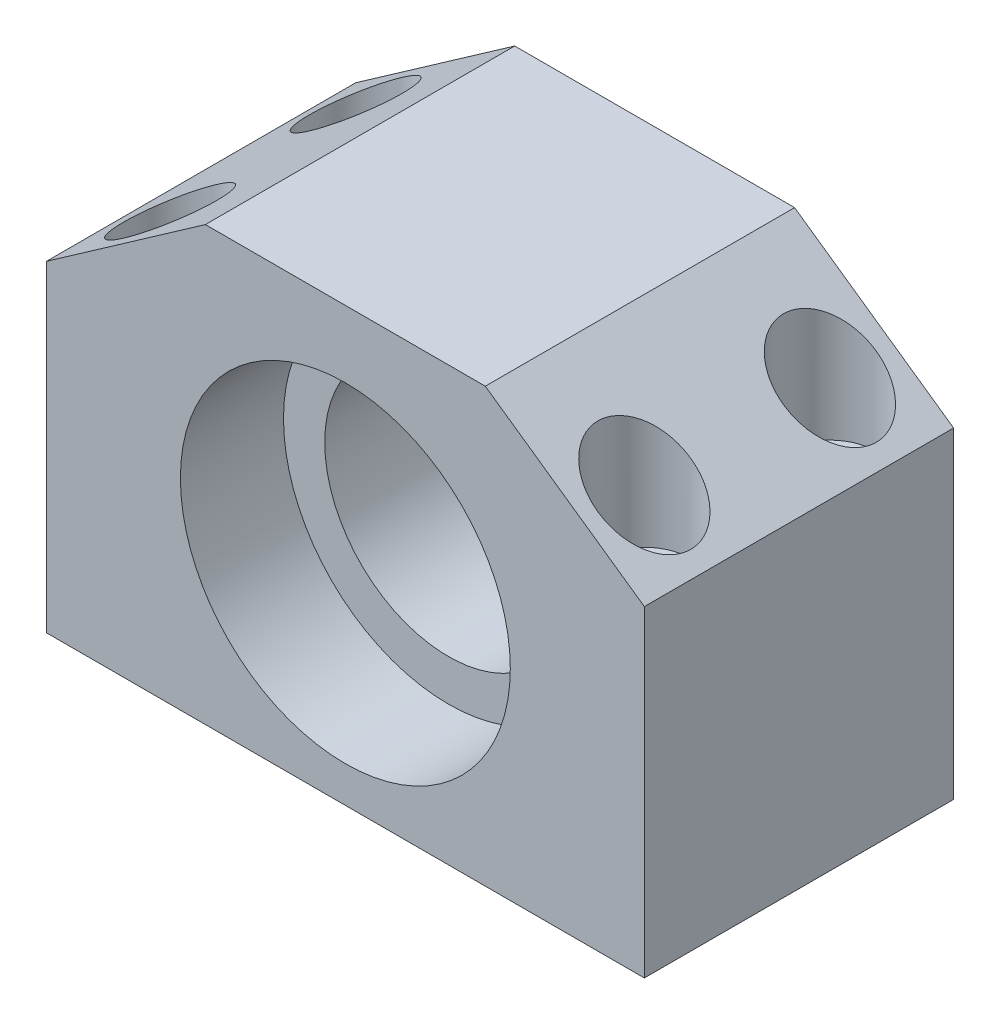
ISO-10303-21;
HEADER;
FILE_DESCRIPTION(('STEP AP214'),'2;1');
FILE_NAME('part.step','',(''),(''),'','','');
FILE_SCHEMA(('AUTOMOTIVE_DESIGN { 1 0 10303 214 1 1 1 1 }'));
ENDSEC;
DATA;
#1=APPLICATION_CONTEXT('core data for automotive mechanical design processes');
#2=APPLICATION_PROTOCOL_DEFINITION('international standard','automotive_design',2000,#1);
#3=PRODUCT_CONTEXT('',#1,'mechanical');
#4=PRODUCT('Part','Part','',(#3));
#5=PRODUCT_RELATED_PRODUCT_CATEGORY('part','',(#4));
#6=PRODUCT_DEFINITION_FORMATION('','',#4);
#7=PRODUCT_DEFINITION_CONTEXT('part definition',#1,'design');
#8=PRODUCT_DEFINITION('design','',#6,#7);
#9=PRODUCT_DEFINITION_SHAPE('','',#8);
#10=(LENGTH_UNIT() NAMED_UNIT(*) SI_UNIT(.MILLI.,.METRE.));
#11=(NAMED_UNIT(*) PLANE_ANGLE_UNIT() SI_UNIT($,.RADIAN.));
#12=(NAMED_UNIT(*) SI_UNIT($,.STERADIAN.) SOLID_ANGLE_UNIT());
#13=UNCERTAINTY_MEASURE_WITH_UNIT(LENGTH_MEASURE(1.E-05),#10,'distance_accuracy_value','');
#14=(GEOMETRIC_REPRESENTATION_CONTEXT(3) GLOBAL_UNCERTAINTY_ASSIGNED_CONTEXT((#13)) GLOBAL_UNIT_ASSIGNED_CONTEXT((#10,
#11,#12)) REPRESENTATION_CONTEXT('',''));
#15=CARTESIAN_POINT('',(0.,0.,0.));
#16=DIRECTION('',(0.,0.,1.));
#17=DIRECTION('',(1.,0.,0.));
#18=AXIS2_PLACEMENT_3D('',#15,#16,#17);
#19=CARTESIAN_POINT('',(-29.,42.,-15.));
#20=DIRECTION('',(0.,0.,1.));
#21=DIRECTION('',(1.,0.,0.));
#22=AXIS2_PLACEMENT_3D('',#19,#20,#21);
#23=PLANE('',#22);
#24=CARTESIAN_POINT('',(0.,19.5,-15.));
#25=DIRECTION('',(0.,0.,1.));
#26=DIRECTION('',(1.,0.,0.));
#27=AXIS2_PLACEMENT_3D('',#24,#25,#26);
#28=CIRCLE('',#27,16.);
#29=CARTESIAN_POINT('',(16.,19.5,-15.));
#30=VERTEX_POINT('',#29);
#31=EDGE_CURVE('E175',#30,#30,#28,.T.);
#32=ORIENTED_EDGE('',*,*,#31,.T.);
#33=EDGE_LOOP('',(#32));
#34=FACE_BOUND('',#33,.T.);
#35=DIRECTION('',(0.819152044288991,0.573576436351047,0.));
#36=VECTOR('',#35,1.);
#37=CARTESIAN_POINT('',(-24.1995227617897,34.5605001963602,-15.));
#38=LINE('',#37,#36);
#39=CARTESIAN_POINT('',(-29.,31.1991698471612,-15.));
#40=VERTEX_POINT('',#39);
#41=CARTESIAN_POINT('',(-13.5748159460632,42.,-15.));
#42=VERTEX_POINT('',#41);
#43=EDGE_CURVE('E49',#40,#42,#38,.T.);
#44=ORIENTED_EDGE('',*,*,#43,.T.);
#45=DIRECTION('',(-1.,0.,0.));
#46=VECTOR('',#45,1.);
#47=CARTESIAN_POINT('',(-29.,42.,-15.));
#48=LINE('',#47,#46);
#49=CARTESIAN_POINT('',(13.5748159460634,42.,-15.));
#50=VERTEX_POINT('',#49);
#51=EDGE_CURVE('E184',#50,#42,#48,.T.);
#52=ORIENTED_EDGE('',*,*,#51,.F.);
#53=DIRECTION('',(0.819152044288991,-0.573576436351047,0.));
#54=VECTOR('',#53,1.);
#55=CARTESIAN_POINT('',(24.1995227617897,34.5605001963603,-15.));
#56=LINE('',#55,#54);
#57=CARTESIAN_POINT('',(29.,31.1991698471613,-15.));
#58=VERTEX_POINT('',#57);
#59=EDGE_CURVE('E57',#50,#58,#56,.T.);
#60=ORIENTED_EDGE('',*,*,#59,.T.);
#61=DIRECTION('',(0.,-1.,0.));
#62=VECTOR('',#61,1.);
#63=CARTESIAN_POINT('',(29.,42.,-15.));
#64=LINE('',#63,#62);
#65=CARTESIAN_POINT('',(29.,0.,-15.));
#66=VERTEX_POINT('',#65);
#67=EDGE_CURVE('E11',#58,#66,#64,.T.);
#68=ORIENTED_EDGE('',*,*,#67,.T.);
#69=DIRECTION('',(-1.,0.,0.));
#70=VECTOR('',#69,1.);
#71=CARTESIAN_POINT('',(-29.,0.,-15.));
#72=LINE('',#71,#70);
#73=CARTESIAN_POINT('',(-29.,0.,-15.));
#74=VERTEX_POINT('',#73);
#75=EDGE_CURVE('E191',#66,#74,#72,.T.);
#76=ORIENTED_EDGE('',*,*,#75,.T.);
#77=DIRECTION('',(0.,-1.,0.));
#78=VECTOR('',#77,1.);
#79=CARTESIAN_POINT('',(-29.,42.,-15.));
#80=LINE('',#79,#78);
#81=EDGE_CURVE('E41',#40,#74,#80,.T.);
#82=ORIENTED_EDGE('',*,*,#81,.F.);
#83=EDGE_LOOP('',(#44,#52,#60,#68,#76,#82));
#84=FACE_BOUND('',#83,.T.);
#85=ADVANCED_FACE('F32',(#34,#84),#23,.F.);
#86=CARTESIAN_POINT('',(-29.,42.,15.));
#87=DIRECTION('',(0.,0.,-1.));
#88=DIRECTION('',(-1.,0.,0.));
#89=AXIS2_PLACEMENT_3D('',#86,#87,#88);
#90=PLANE('',#89);
#91=CARTESIAN_POINT('',(0.,19.5,15.));
#92=DIRECTION('',(0.,0.,1.));
#93=DIRECTION('',(1.,0.,0.));
#94=AXIS2_PLACEMENT_3D('',#91,#92,#93);
#95=CIRCLE('',#94,16.);
#96=CARTESIAN_POINT('',(16.,19.5,15.));
#97=VERTEX_POINT('',#96);
#98=EDGE_CURVE('E121',#97,#97,#95,.T.);
#99=ORIENTED_EDGE('',*,*,#98,.F.);
#100=EDGE_LOOP('',(#99));
#101=FACE_BOUND('',#100,.T.);
#102=DIRECTION('',(0.819152044288991,0.573576436351047,0.));
#103=VECTOR('',#102,1.);
#104=CARTESIAN_POINT('',(-24.1995227617897,34.5605001963602,15.));
#105=LINE('',#104,#103);
#106=CARTESIAN_POINT('',(-29.,31.1991698471612,15.));
#107=VERTEX_POINT('',#106);
#108=CARTESIAN_POINT('',(-13.5748159460632,42.,15.));
#109=VERTEX_POINT('',#108);
#110=EDGE_CURVE('E88',#107,#109,#105,.T.);
#111=ORIENTED_EDGE('',*,*,#110,.F.);
#112=DIRECTION('',(0.,-1.,0.));
#113=VECTOR('',#112,1.);
#114=CARTESIAN_POINT('',(-29.,42.,15.));
#115=LINE('',#114,#113);
#116=CARTESIAN_POINT('',(-29.,0.,15.));
#117=VERTEX_POINT('',#116);
#118=EDGE_CURVE('E99',#107,#117,#115,.T.);
#119=ORIENTED_EDGE('',*,*,#118,.T.);
#120=DIRECTION('',(1.,0.,0.));
#121=VECTOR('',#120,1.);
#122=CARTESIAN_POINT('',(-29.,0.,15.));
#123=LINE('',#122,#121);
#124=CARTESIAN_POINT('',(29.,0.,15.));
#125=VERTEX_POINT('',#124);
#126=EDGE_CURVE('E187',#117,#125,#123,.T.);
#127=ORIENTED_EDGE('',*,*,#126,.T.);
#128=DIRECTION('',(0.,-1.,0.));
#129=VECTOR('',#128,1.);
#130=CARTESIAN_POINT('',(29.,42.,15.));
#131=LINE('',#130,#129);
#132=CARTESIAN_POINT('',(29.,31.1991698471613,15.));
#133=VERTEX_POINT('',#132);
#134=EDGE_CURVE('E108',#133,#125,#131,.T.);
#135=ORIENTED_EDGE('',*,*,#134,.F.);
#136=DIRECTION('',(0.819152044288991,-0.573576436351047,0.));
#137=VECTOR('',#136,1.);
#138=CARTESIAN_POINT('',(24.1995227617897,34.5605001963603,15.));
#139=LINE('',#138,#137);
#140=CARTESIAN_POINT('',(13.5748159460634,42.,15.));
#141=VERTEX_POINT('',#140);
#142=EDGE_CURVE('E135',#141,#133,#139,.T.);
#143=ORIENTED_EDGE('',*,*,#142,.F.);
#144=DIRECTION('',(1.,0.,0.));
#145=VECTOR('',#144,1.);
#146=CARTESIAN_POINT('',(-29.,42.,15.));
#147=LINE('',#146,#145);
#148=EDGE_CURVE('E102',#109,#141,#147,.T.);
#149=ORIENTED_EDGE('',*,*,#148,.F.);
#150=EDGE_LOOP('',(#111,#119,#127,#135,#143,#149));
#151=FACE_BOUND('',#150,.T.);
#152=ADVANCED_FACE('F97',(#101,#151),#90,.F.);
#153=CARTESIAN_POINT('',(0.,42.,0.));
#154=DIRECTION('',(0.,-1.,0.));
#155=DIRECTION('',(0.,0.,-1.));
#156=AXIS2_PLACEMENT_3D('',#153,#154,#155);
#157=PLANE('',#156);
#158=DIRECTION('',(0.,0.,-1.));
#159=VECTOR('',#158,1.);
#160=CARTESIAN_POINT('',(-13.5748159460632,42.,15.));
#161=LINE('',#160,#159);
#162=EDGE_CURVE('E93',#109,#42,#161,.T.);
#163=ORIENTED_EDGE('',*,*,#162,.F.);
#164=ORIENTED_EDGE('',*,*,#148,.T.);
#165=DIRECTION('',(0.,0.,-1.));
#166=VECTOR('',#165,1.);
#167=CARTESIAN_POINT('',(13.5748159460634,42.,15.));
#168=LINE('',#167,#166);
#169=EDGE_CURVE('E132',#141,#50,#168,.T.);
#170=ORIENTED_EDGE('',*,*,#169,.T.);
#171=ORIENTED_EDGE('',*,*,#51,.T.);
#172=EDGE_LOOP('',(#163,#164,#170,#171));
#173=FACE_BOUND('',#172,.T.);
#174=ADVANCED_FACE('F211',(#173),#157,.F.);
#175=CARTESIAN_POINT('',(-29.,42.,15.));
#176=DIRECTION('',(1.,0.,0.));
#177=DIRECTION('',(0.,0.,-1.));
#178=AXIS2_PLACEMENT_3D('',#175,#176,#177);
#179=PLANE('',#178);
#180=DIRECTION('',(0.,0.,-1.));
#181=VECTOR('',#180,1.);
#182=CARTESIAN_POINT('',(-29.,31.1991698471612,15.));
#183=LINE('',#182,#181);
#184=EDGE_CURVE('E84',#107,#40,#183,.T.);
#185=ORIENTED_EDGE('',*,*,#184,.T.);
#186=ORIENTED_EDGE('',*,*,#81,.T.);
#187=DIRECTION('',(0.,0.,1.));
#188=VECTOR('',#187,1.);
#189=CARTESIAN_POINT('',(-29.,0.,15.));
#190=LINE('',#189,#188);
#191=EDGE_CURVE('E106',#74,#117,#190,.T.);
#192=ORIENTED_EDGE('',*,*,#191,.T.);
#193=ORIENTED_EDGE('',*,*,#118,.F.);
#194=EDGE_LOOP('',(#185,#186,#192,#193));
#195=FACE_BOUND('',#194,.T.);
#196=ADVANCED_FACE('F104',(#195),#179,.F.);
#197=CARTESIAN_POINT('',(-23.,42.,-9.));
#198=DIRECTION('',(0.,1.,0.));
#199=DIRECTION('',(0.,0.,1.));
#200=AXIS2_PLACEMENT_3D('',#197,#198,#199);
#201=CYLINDRICAL_SURFACE('',#200,4.5);
#202=CARTESIAN_POINT('',(-23.,27.,-9.));
#203=DIRECTION('',(0.,1.,0.));
#204=DIRECTION('',(0.,0.,1.));
#205=AXIS2_PLACEMENT_3D('',#202,#203,#204);
#206=CIRCLE('',#205,4.5);
#207=CARTESIAN_POINT('',(-23.,27.,-4.5));
#208=VERTEX_POINT('',#207);
#209=EDGE_CURVE('E148',#208,#208,#206,.T.);
#210=ORIENTED_EDGE('',*,*,#209,.F.);
#211=EDGE_LOOP('',(#210));
#212=FACE_BOUND('',#211,.T.);
#213=CARTESIAN_POINT('',(-23.,35.4004150764195,-9.));
#214=DIRECTION('',(-0.573576436351047,0.819152044288991,0.));
#215=DIRECTION('',(0.819152044288991,0.573576436351047,0.));
#216=AXIS2_PLACEMENT_3D('',#213,#214,#215);
#217=ELLIPSE('',#216,5.49348564942655,4.5);
#218=CARTESIAN_POINT('',(-18.5,38.5513489983632,-9.));
#219=VERTEX_POINT('',#218);
#220=EDGE_CURVE('E203',#219,#219,#217,.F.);
#221=ORIENTED_EDGE('',*,*,#220,.F.);
#222=EDGE_LOOP('',(#221));
#223=FACE_BOUND('',#222,.T.);
#224=ADVANCED_FACE('F244',(#212,#223),#201,.F.);
#225=CARTESIAN_POINT('',(-23.,42.,9.));
#226=DIRECTION('',(0.,1.,0.));
#227=DIRECTION('',(0.,0.,1.));
#228=AXIS2_PLACEMENT_3D('',#225,#226,#227);
#229=CYLINDRICAL_SURFACE('',#228,4.5);
#230=CARTESIAN_POINT('',(-23.,27.,9.));
#231=DIRECTION('',(0.,1.,0.));
#232=DIRECTION('',(0.,0.,1.));
#233=AXIS2_PLACEMENT_3D('',#230,#231,#232);
#234=CIRCLE('',#233,4.5);
#235=CARTESIAN_POINT('',(-23.,27.,13.5));
#236=VERTEX_POINT('',#235);
#237=EDGE_CURVE('E130',#236,#236,#234,.T.);
#238=ORIENTED_EDGE('',*,*,#237,.F.);
#239=EDGE_LOOP('',(#238));
#240=FACE_BOUND('',#239,.T.);
#241=CARTESIAN_POINT('',(-23.,35.4004150764195,9.));
#242=DIRECTION('',(-0.573576436351047,0.819152044288991,0.));
#243=DIRECTION('',(0.819152044288991,0.573576436351047,0.));
#244=AXIS2_PLACEMENT_3D('',#241,#242,#243);
#245=ELLIPSE('',#244,5.49348564942655,4.5);
#246=CARTESIAN_POINT('',(-18.5,38.5513489983632,9.));
#247=VERTEX_POINT('',#246);
#248=EDGE_CURVE('E36',#247,#247,#245,.F.);
#249=ORIENTED_EDGE('',*,*,#248,.F.);
#250=EDGE_LOOP('',(#249));
#251=FACE_BOUND('',#250,.T.);
#252=ADVANCED_FACE('F231',(#240,#251),#229,.F.);
#253=CARTESIAN_POINT('',(29.,42.,15.));
#254=DIRECTION('',(-1.,0.,0.));
#255=DIRECTION('',(0.,0.,1.));
#256=AXIS2_PLACEMENT_3D('',#253,#254,#255);
#257=PLANE('',#256);
#258=DIRECTION('',(0.,0.,-1.));
#259=VECTOR('',#258,1.);
#260=CARTESIAN_POINT('',(29.,31.1991698471613,15.));
#261=LINE('',#260,#259);
#262=EDGE_CURVE('E126',#133,#58,#261,.T.);
#263=ORIENTED_EDGE('',*,*,#262,.F.);
#264=ORIENTED_EDGE('',*,*,#134,.T.);
#265=DIRECTION('',(0.,0.,-1.));
#266=VECTOR('',#265,1.);
#267=CARTESIAN_POINT('',(29.,0.,15.));
#268=LINE('',#267,#266);
#269=EDGE_CURVE('E117',#125,#66,#268,.T.);
#270=ORIENTED_EDGE('',*,*,#269,.T.);
#271=ORIENTED_EDGE('',*,*,#67,.F.);
#272=EDGE_LOOP('',(#263,#264,#270,#271));
#273=FACE_BOUND('',#272,.T.);
#274=ADVANCED_FACE('F34',(#273),#257,.F.);
#275=CARTESIAN_POINT('',(23.,42.,-9.));
#276=DIRECTION('',(0.,1.,0.));
#277=DIRECTION('',(0.,0.,1.));
#278=AXIS2_PLACEMENT_3D('',#275,#276,#277);
#279=CYLINDRICAL_SURFACE('',#278,4.5);
#280=CARTESIAN_POINT('',(23.,27.,-9.));
#281=DIRECTION('',(0.,1.,0.));
#282=DIRECTION('',(0.,0.,1.));
#283=AXIS2_PLACEMENT_3D('',#280,#281,#282);
#284=CIRCLE('',#283,4.5);
#285=CARTESIAN_POINT('',(23.,27.,-4.5));
#286=VERTEX_POINT('',#285);
#287=EDGE_CURVE('E166',#286,#286,#284,.T.);
#288=ORIENTED_EDGE('',*,*,#287,.F.);
#289=EDGE_LOOP('',(#288));
#290=FACE_BOUND('',#289,.T.);
#291=CARTESIAN_POINT('',(23.,35.4004150764196,-9.));
#292=DIRECTION('',(0.573576436351047,0.819152044288991,0.));
#293=DIRECTION('',(-0.819152044288991,0.573576436351047,0.));
#294=AXIS2_PLACEMENT_3D('',#291,#292,#293);
#295=ELLIPSE('',#294,5.49348564942655,4.5);
#296=CARTESIAN_POINT('',(18.5,38.5513489983633,-9.));
#297=VERTEX_POINT('',#296);
#298=EDGE_CURVE('E125',#297,#297,#295,.F.);
#299=ORIENTED_EDGE('',*,*,#298,.F.);
#300=EDGE_LOOP('',(#299));
#301=FACE_BOUND('',#300,.T.);
#302=ADVANCED_FACE('F219',(#290,#301),#279,.F.);
#303=CARTESIAN_POINT('',(23.,42.,9.));
#304=DIRECTION('',(0.,1.,0.));
#305=DIRECTION('',(0.,0.,1.));
#306=AXIS2_PLACEMENT_3D('',#303,#304,#305);
#307=CYLINDRICAL_SURFACE('',#306,4.5);
#308=CARTESIAN_POINT('',(23.,27.,9.));
#309=DIRECTION('',(0.,1.,0.));
#310=DIRECTION('',(0.,0.,1.));
#311=AXIS2_PLACEMENT_3D('',#308,#309,#310);
#312=CIRCLE('',#311,4.5);
#313=CARTESIAN_POINT('',(23.,27.,13.5));
#314=VERTEX_POINT('',#313);
#315=EDGE_CURVE('E157',#314,#314,#312,.T.);
#316=ORIENTED_EDGE('',*,*,#315,.F.);
#317=EDGE_LOOP('',(#316));
#318=FACE_BOUND('',#317,.T.);
#319=CARTESIAN_POINT('',(23.,35.4004150764196,9.));
#320=DIRECTION('',(0.573576436351047,0.819152044288991,0.));
#321=DIRECTION('',(-0.819152044288991,0.573576436351047,0.));
#322=AXIS2_PLACEMENT_3D('',#319,#320,#321);
#323=ELLIPSE('',#322,5.49348564942655,4.5);
#324=CARTESIAN_POINT('',(18.5,38.5513489983633,9.));
#325=VERTEX_POINT('',#324);
#326=EDGE_CURVE('E123',#325,#325,#323,.F.);
#327=ORIENTED_EDGE('',*,*,#326,.F.);
#328=EDGE_LOOP('',(#327));
#329=FACE_BOUND('',#328,.T.);
#330=ADVANCED_FACE('F221',(#318,#329),#307,.F.);
#331=CARTESIAN_POINT('',(0.,19.5,-15.));
#332=DIRECTION('',(0.,0.,1.));
#333=DIRECTION('',(1.,0.,0.));
#334=AXIS2_PLACEMENT_3D('',#331,#332,#333);
#335=CYLINDRICAL_SURFACE('',#334,12.);
#336=CARTESIAN_POINT('',(0.,19.5,5.));
#337=DIRECTION('',(0.,0.,1.));
#338=DIRECTION('',(1.,0.,0.));
#339=AXIS2_PLACEMENT_3D('',#336,#337,#338);
#340=CIRCLE('',#339,12.);
#341=CARTESIAN_POINT('',(12.,19.5,5.));
#342=VERTEX_POINT('',#341);
#343=EDGE_CURVE('E114',#342,#342,#340,.F.);
#344=ORIENTED_EDGE('',*,*,#343,.F.);
#345=EDGE_LOOP('',(#344));
#346=FACE_BOUND('',#345,.T.);
#347=CARTESIAN_POINT('',(0.,19.5,-5.));
#348=DIRECTION('',(0.,0.,-1.));
#349=DIRECTION('',(-1.,0.,0.));
#350=AXIS2_PLACEMENT_3D('',#347,#348,#349);
#351=CIRCLE('',#350,12.);
#352=CARTESIAN_POINT('',(-12.,19.5,-5.));
#353=VERTEX_POINT('',#352);
#354=EDGE_CURVE('E119',#353,#353,#351,.F.);
#355=ORIENTED_EDGE('',*,*,#354,.F.);
#356=EDGE_LOOP('',(#355));
#357=FACE_BOUND('',#356,.T.);
#358=ADVANCED_FACE('F228',(#346,#357),#335,.F.);
#359=CARTESIAN_POINT('',(0.,0.,0.));
#360=DIRECTION('',(0.,-1.,0.));
#361=DIRECTION('',(0.,0.,-1.));
#362=AXIS2_PLACEMENT_3D('',#359,#360,#361);
#363=PLANE('',#362);
#364=CARTESIAN_POINT('',(-23.,0.,9.));
#365=DIRECTION('',(0.,1.,0.));
#366=DIRECTION('',(0.,0.,1.));
#367=AXIS2_PLACEMENT_3D('',#364,#365,#366);
#368=CIRCLE('',#367,2.74999999999999);
#369=CARTESIAN_POINT('',(-23.,0.,11.75));
#370=VERTEX_POINT('',#369);
#371=EDGE_CURVE('E145',#370,#370,#368,.T.);
#372=ORIENTED_EDGE('',*,*,#371,.T.);
#373=EDGE_LOOP('',(#372));
#374=FACE_BOUND('',#373,.T.);
#375=CARTESIAN_POINT('',(-23.,0.,-9.));
#376=DIRECTION('',(0.,1.,0.));
#377=DIRECTION('',(0.,0.,1.));
#378=AXIS2_PLACEMENT_3D('',#375,#376,#377);
#379=CIRCLE('',#378,2.74999999999999);
#380=CARTESIAN_POINT('',(-23.,0.,-6.25000000000001));
#381=VERTEX_POINT('',#380);
#382=EDGE_CURVE('E154',#381,#381,#379,.T.);
#383=ORIENTED_EDGE('',*,*,#382,.T.);
#384=EDGE_LOOP('',(#383));
#385=FACE_BOUND('',#384,.T.);
#386=CARTESIAN_POINT('',(23.,0.,9.));
#387=DIRECTION('',(0.,1.,0.));
#388=DIRECTION('',(0.,0.,1.));
#389=AXIS2_PLACEMENT_3D('',#386,#387,#388);
#390=CIRCLE('',#389,2.74999999999999);
#391=CARTESIAN_POINT('',(23.,0.,11.75));
#392=VERTEX_POINT('',#391);
#393=EDGE_CURVE('E163',#392,#392,#390,.T.);
#394=ORIENTED_EDGE('',*,*,#393,.T.);
#395=EDGE_LOOP('',(#394));
#396=FACE_BOUND('',#395,.T.);
#397=CARTESIAN_POINT('',(23.,0.,-9.));
#398=DIRECTION('',(0.,1.,0.));
#399=DIRECTION('',(0.,0.,1.));
#400=AXIS2_PLACEMENT_3D('',#397,#398,#399);
#401=CIRCLE('',#400,2.74999999999999);
#402=CARTESIAN_POINT('',(23.,0.,-6.25000000000001));
#403=VERTEX_POINT('',#402);
#404=EDGE_CURVE('E172',#403,#403,#401,.T.);
#405=ORIENTED_EDGE('',*,*,#404,.T.);
#406=EDGE_LOOP('',(#405));
#407=FACE_BOUND('',#406,.T.);
#408=ORIENTED_EDGE('',*,*,#269,.F.);
#409=ORIENTED_EDGE('',*,*,#126,.F.);
#410=ORIENTED_EDGE('',*,*,#191,.F.);
#411=ORIENTED_EDGE('',*,*,#75,.F.);
#412=EDGE_LOOP('',(#408,#409,#410,#411));
#413=FACE_BOUND('',#412,.T.);
#414=ADVANCED_FACE('F198',(#374,#385,#396,#407,#413),#363,.T.);
#415=CARTESIAN_POINT('',(0.,19.5,5.));
#416=DIRECTION('',(0.,0.,1.));
#417=DIRECTION('',(1.,0.,0.));
#418=AXIS2_PLACEMENT_3D('',#415,#416,#417);
#419=PLANE('',#418);
#420=CARTESIAN_POINT('',(0.,19.5,5.));
#421=DIRECTION('',(0.,0.,1.));
#422=DIRECTION('',(1.,0.,0.));
#423=AXIS2_PLACEMENT_3D('',#420,#421,#422);
#424=CIRCLE('',#423,16.);
#425=CARTESIAN_POINT('',(16.,19.5,5.));
#426=VERTEX_POINT('',#425);
#427=EDGE_CURVE('E118',#426,#426,#424,.T.);
#428=ORIENTED_EDGE('',*,*,#427,.T.);
#429=EDGE_LOOP('',(#428));
#430=FACE_BOUND('',#429,.T.);
#431=ORIENTED_EDGE('',*,*,#343,.T.);
#432=EDGE_LOOP('',(#431));
#433=FACE_BOUND('',#432,.T.);
#434=ADVANCED_FACE('F248',(#430,#433),#419,.T.);
#435=CARTESIAN_POINT('',(0.,19.5,5.));
#436=DIRECTION('',(0.,0.,1.));
#437=DIRECTION('',(1.,0.,0.));
#438=AXIS2_PLACEMENT_3D('',#435,#436,#437);
#439=CYLINDRICAL_SURFACE('',#438,16.);
#440=ORIENTED_EDGE('',*,*,#427,.F.);
#441=EDGE_LOOP('',(#440));
#442=FACE_BOUND('',#441,.T.);
#443=ORIENTED_EDGE('',*,*,#98,.T.);
#444=EDGE_LOOP('',(#443));
#445=FACE_BOUND('',#444,.T.);
#446=ADVANCED_FACE('F255',(#442,#445),#439,.F.);
#447=CARTESIAN_POINT('',(0.,19.5,-5.));
#448=DIRECTION('',(0.,0.,-1.));
#449=DIRECTION('',(1.,0.,0.));
#450=AXIS2_PLACEMENT_3D('',#447,#448,#449);
#451=PLANE('',#450);
#452=CARTESIAN_POINT('',(0.,19.5,-5.));
#453=DIRECTION('',(0.,0.,1.));
#454=DIRECTION('',(1.,0.,0.));
#455=AXIS2_PLACEMENT_3D('',#452,#453,#454);
#456=CIRCLE('',#455,16.);
#457=CARTESIAN_POINT('',(16.,19.5,-5.));
#458=VERTEX_POINT('',#457);
#459=EDGE_CURVE('E122',#458,#458,#456,.T.);
#460=ORIENTED_EDGE('',*,*,#459,.F.);
#461=EDGE_LOOP('',(#460));
#462=FACE_BOUND('',#461,.T.);
#463=ORIENTED_EDGE('',*,*,#354,.T.);
#464=EDGE_LOOP('',(#463));
#465=FACE_BOUND('',#464,.T.);
#466=ADVANCED_FACE('F258',(#462,#465),#451,.T.);
#467=CARTESIAN_POINT('',(0.,19.5,-5.));
#468=DIRECTION('',(0.,0.,-1.));
#469=DIRECTION('',(-1.,0.,0.));
#470=AXIS2_PLACEMENT_3D('',#467,#468,#469);
#471=CYLINDRICAL_SURFACE('',#470,16.);
#472=ORIENTED_EDGE('',*,*,#459,.T.);
#473=EDGE_LOOP('',(#472));
#474=FACE_BOUND('',#473,.T.);
#475=ORIENTED_EDGE('',*,*,#31,.F.);
#476=EDGE_LOOP('',(#475));
#477=FACE_BOUND('',#476,.T.);
#478=ADVANCED_FACE('F263',(#474,#477),#471,.F.);
#479=CARTESIAN_POINT('',(23.,42.,-9.));
#480=DIRECTION('',(0.,1.,0.));
#481=DIRECTION('',(0.,0.,1.));
#482=AXIS2_PLACEMENT_3D('',#479,#480,#481);
#483=CYLINDRICAL_SURFACE('',#482,2.74999999999999);
#484=ORIENTED_EDGE('',*,*,#404,.F.);
#485=EDGE_LOOP('',(#484));
#486=FACE_BOUND('',#485,.T.);
#487=CARTESIAN_POINT('',(23.,27.,-9.));
#488=DIRECTION('',(0.,1.,0.));
#489=DIRECTION('',(0.,0.,1.));
#490=AXIS2_PLACEMENT_3D('',#487,#488,#489);
#491=CIRCLE('',#490,2.75);
#492=CARTESIAN_POINT('',(23.,27.,-6.25));
#493=VERTEX_POINT('',#492);
#494=EDGE_CURVE('E169',#493,#493,#491,.T.);
#495=ORIENTED_EDGE('',*,*,#494,.T.);
#496=EDGE_LOOP('',(#495));
#497=FACE_BOUND('',#496,.T.);
#498=ADVANCED_FACE('F266',(#486,#497),#483,.F.);
#499=CARTESIAN_POINT('',(25.75,27.,-9.));
#500=DIRECTION('',(0.,-1.,0.));
#501=DIRECTION('',(0.,0.,-1.));
#502=AXIS2_PLACEMENT_3D('',#499,#500,#501);
#503=PLANE('',#502);
#504=ORIENTED_EDGE('',*,*,#494,.F.);
#505=EDGE_LOOP('',(#504));
#506=FACE_BOUND('',#505,.T.);
#507=ORIENTED_EDGE('',*,*,#287,.T.);
#508=EDGE_LOOP('',(#507));
#509=FACE_BOUND('',#508,.T.);
#510=ADVANCED_FACE('F272',(#506,#509),#503,.F.);
#511=CARTESIAN_POINT('',(23.,42.,9.));
#512=DIRECTION('',(0.,1.,0.));
#513=DIRECTION('',(0.,0.,1.));
#514=AXIS2_PLACEMENT_3D('',#511,#512,#513);
#515=CYLINDRICAL_SURFACE('',#514,2.74999999999999);
#516=ORIENTED_EDGE('',*,*,#393,.F.);
#517=EDGE_LOOP('',(#516));
#518=FACE_BOUND('',#517,.T.);
#519=CARTESIAN_POINT('',(23.,27.,9.));
#520=DIRECTION('',(0.,1.,0.));
#521=DIRECTION('',(0.,0.,1.));
#522=AXIS2_PLACEMENT_3D('',#519,#520,#521);
#523=CIRCLE('',#522,2.75);
#524=CARTESIAN_POINT('',(23.,27.,11.75));
#525=VERTEX_POINT('',#524);
#526=EDGE_CURVE('E160',#525,#525,#523,.T.);
#527=ORIENTED_EDGE('',*,*,#526,.T.);
#528=EDGE_LOOP('',(#527));
#529=FACE_BOUND('',#528,.T.);
#530=ADVANCED_FACE('F275',(#518,#529),#515,.F.);
#531=CARTESIAN_POINT('',(25.75,27.,9.));
#532=DIRECTION('',(0.,-1.,0.));
#533=DIRECTION('',(0.,0.,-1.));
#534=AXIS2_PLACEMENT_3D('',#531,#532,#533);
#535=PLANE('',#534);
#536=ORIENTED_EDGE('',*,*,#526,.F.);
#537=EDGE_LOOP('',(#536));
#538=FACE_BOUND('',#537,.T.);
#539=ORIENTED_EDGE('',*,*,#315,.T.);
#540=EDGE_LOOP('',(#539));
#541=FACE_BOUND('',#540,.T.);
#542=ADVANCED_FACE('F280',(#538,#541),#535,.F.);
#543=CARTESIAN_POINT('',(-23.,42.,-9.));
#544=DIRECTION('',(0.,1.,0.));
#545=DIRECTION('',(0.,0.,1.));
#546=AXIS2_PLACEMENT_3D('',#543,#544,#545);
#547=CYLINDRICAL_SURFACE('',#546,2.74999999999999);
#548=ORIENTED_EDGE('',*,*,#382,.F.);
#549=EDGE_LOOP('',(#548));
#550=FACE_BOUND('',#549,.T.);
#551=CARTESIAN_POINT('',(-23.,27.,-9.));
#552=DIRECTION('',(0.,1.,0.));
#553=DIRECTION('',(0.,0.,1.));
#554=AXIS2_PLACEMENT_3D('',#551,#552,#553);
#555=CIRCLE('',#554,2.75);
#556=CARTESIAN_POINT('',(-23.,27.,-6.25));
#557=VERTEX_POINT('',#556);
#558=EDGE_CURVE('E151',#557,#557,#555,.T.);
#559=ORIENTED_EDGE('',*,*,#558,.T.);
#560=EDGE_LOOP('',(#559));
#561=FACE_BOUND('',#560,.T.);
#562=ADVANCED_FACE('F288',(#550,#561),#547,.F.);
#563=CARTESIAN_POINT('',(-20.25,27.,-9.));
#564=DIRECTION('',(0.,-1.,0.));
#565=DIRECTION('',(0.,0.,-1.));
#566=AXIS2_PLACEMENT_3D('',#563,#564,#565);
#567=PLANE('',#566);
#568=ORIENTED_EDGE('',*,*,#558,.F.);
#569=EDGE_LOOP('',(#568));
#570=FACE_BOUND('',#569,.T.);
#571=ORIENTED_EDGE('',*,*,#209,.T.);
#572=EDGE_LOOP('',(#571));
#573=FACE_BOUND('',#572,.T.);
#574=ADVANCED_FACE('F296',(#570,#573),#567,.F.);
#575=CARTESIAN_POINT('',(-23.,42.,9.));
#576=DIRECTION('',(0.,1.,0.));
#577=DIRECTION('',(0.,0.,1.));
#578=AXIS2_PLACEMENT_3D('',#575,#576,#577);
#579=CYLINDRICAL_SURFACE('',#578,2.74999999999999);
#580=ORIENTED_EDGE('',*,*,#371,.F.);
#581=EDGE_LOOP('',(#580));
#582=FACE_BOUND('',#581,.T.);
#583=CARTESIAN_POINT('',(-23.,27.,9.));
#584=DIRECTION('',(0.,1.,0.));
#585=DIRECTION('',(0.,0.,1.));
#586=AXIS2_PLACEMENT_3D('',#583,#584,#585);
#587=CIRCLE('',#586,2.75);
#588=CARTESIAN_POINT('',(-23.,27.,11.75));
#589=VERTEX_POINT('',#588);
#590=EDGE_CURVE('E142',#589,#589,#587,.T.);
#591=ORIENTED_EDGE('',*,*,#590,.T.);
#592=EDGE_LOOP('',(#591));
#593=FACE_BOUND('',#592,.T.);
#594=ADVANCED_FACE('F300',(#582,#593),#579,.F.);
#595=CARTESIAN_POINT('',(-20.25,27.,9.));
#596=DIRECTION('',(0.,-1.,0.));
#597=DIRECTION('',(0.,0.,-1.));
#598=AXIS2_PLACEMENT_3D('',#595,#596,#597);
#599=PLANE('',#598);
#600=ORIENTED_EDGE('',*,*,#590,.F.);
#601=EDGE_LOOP('',(#600));
#602=FACE_BOUND('',#601,.T.);
#603=ORIENTED_EDGE('',*,*,#237,.T.);
#604=EDGE_LOOP('',(#603));
#605=FACE_BOUND('',#604,.T.);
#606=ADVANCED_FACE('F215',(#602,#605),#599,.F.);
#607=CARTESIAN_POINT('',(24.1995227617897,34.5605001963603,15.));
#608=DIRECTION('',(0.573576436351047,0.819152044288991,0.));
#609=DIRECTION('',(-0.819152044288991,0.573576436351047,0.));
#610=AXIS2_PLACEMENT_3D('',#607,#608,#609);
#611=PLANE('',#610);
#612=ORIENTED_EDGE('',*,*,#326,.T.);
#613=EDGE_LOOP('',(#612));
#614=FACE_BOUND('',#613,.T.);
#615=ORIENTED_EDGE('',*,*,#59,.F.);
#616=ORIENTED_EDGE('',*,*,#169,.F.);
#617=ORIENTED_EDGE('',*,*,#142,.T.);
#618=ORIENTED_EDGE('',*,*,#262,.T.);
#619=EDGE_LOOP('',(#615,#616,#617,#618));
#620=FACE_BOUND('',#619,.T.);
#621=ORIENTED_EDGE('',*,*,#298,.T.);
#622=EDGE_LOOP('',(#621));
#623=FACE_BOUND('',#622,.T.);
#624=ADVANCED_FACE('F212',(#614,#620,#623),#611,.T.);
#625=CARTESIAN_POINT('',(-24.1995227617897,34.5605001963602,15.));
#626=DIRECTION('',(-0.573576436351047,0.819152044288991,0.));
#627=DIRECTION('',(-0.819152044288991,-0.573576436351047,0.));
#628=AXIS2_PLACEMENT_3D('',#625,#626,#627);
#629=PLANE('',#628);
#630=ORIENTED_EDGE('',*,*,#248,.T.);
#631=EDGE_LOOP('',(#630));
#632=FACE_BOUND('',#631,.T.);
#633=ORIENTED_EDGE('',*,*,#43,.F.);
#634=ORIENTED_EDGE('',*,*,#184,.F.);
#635=ORIENTED_EDGE('',*,*,#110,.T.);
#636=ORIENTED_EDGE('',*,*,#162,.T.);
#637=EDGE_LOOP('',(#633,#634,#635,#636));
#638=FACE_BOUND('',#637,.T.);
#639=ORIENTED_EDGE('',*,*,#220,.T.);
#640=EDGE_LOOP('',(#639));
#641=FACE_BOUND('',#640,.T.);
#642=ADVANCED_FACE('F86',(#632,#638,#641),#629,.T.);
#643=CLOSED_SHELL('',(#85,#152,#174,#196,#224,#252,#274,#302,#330,#358,#414,#434,#446,#466,#478,
#498,#510,#530,#542,#562,#574,#594,#606,#624,#642));
#644=MANIFOLD_SOLID_BREP('B2',#643);
#645=ADVANCED_BREP_SHAPE_REPRESENTATION('',(#18,#644),#14);
#646=SHAPE_DEFINITION_REPRESENTATION(#9,#645);
ENDSEC;
END-ISO-10303-21;
